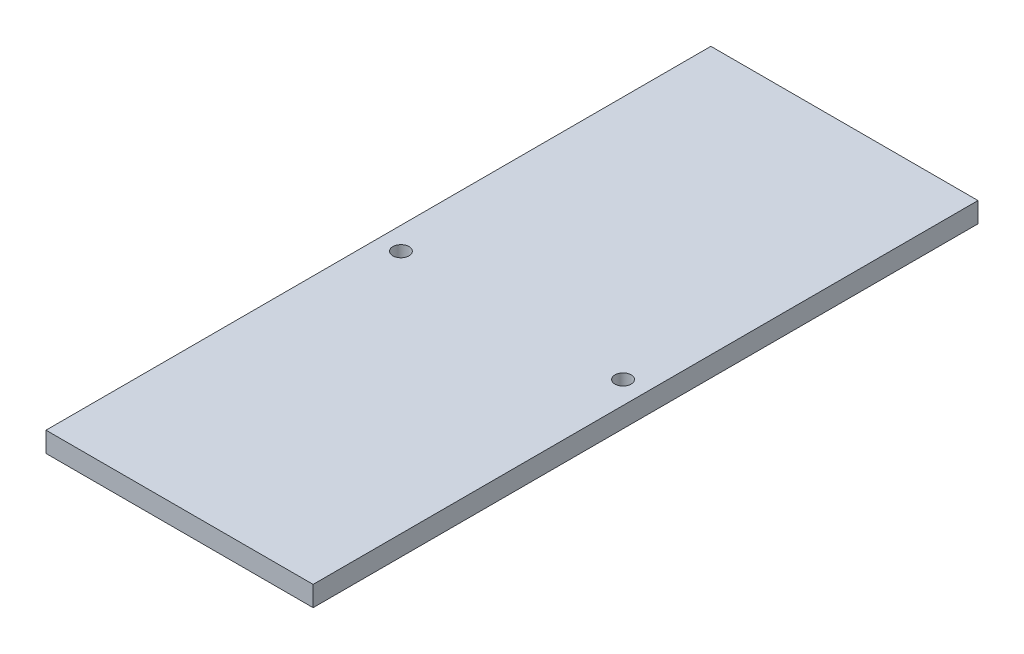
ISO-10303-21;
HEADER;
FILE_DESCRIPTION(('STEP AP214'),'2;1');
FILE_NAME('part.step','',(''),(''),'','','');
FILE_SCHEMA(('AUTOMOTIVE_DESIGN { 1 0 10303 214 1 1 1 1 }'));
ENDSEC;
DATA;
#1=APPLICATION_CONTEXT('core data for automotive mechanical design processes');
#2=APPLICATION_PROTOCOL_DEFINITION('international standard','automotive_design',2000,#1);
#3=PRODUCT_CONTEXT('',#1,'mechanical');
#4=PRODUCT('Part','Part','',(#3));
#5=PRODUCT_RELATED_PRODUCT_CATEGORY('part','',(#4));
#6=PRODUCT_DEFINITION_FORMATION('','',#4);
#7=PRODUCT_DEFINITION_CONTEXT('part definition',#1,'design');
#8=PRODUCT_DEFINITION('design','',#6,#7);
#9=PRODUCT_DEFINITION_SHAPE('','',#8);
#10=(LENGTH_UNIT() NAMED_UNIT(*) SI_UNIT(.MILLI.,.METRE.));
#11=(NAMED_UNIT(*) PLANE_ANGLE_UNIT() SI_UNIT($,.RADIAN.));
#12=(NAMED_UNIT(*) SI_UNIT($,.STERADIAN.) SOLID_ANGLE_UNIT());
#13=UNCERTAINTY_MEASURE_WITH_UNIT(LENGTH_MEASURE(1.E-05),#10,'distance_accuracy_value','');
#14=(GEOMETRIC_REPRESENTATION_CONTEXT(3) GLOBAL_UNCERTAINTY_ASSIGNED_CONTEXT((#13)) GLOBAL_UNIT_ASSIGNED_CONTEXT((#10,
#11,#12)) REPRESENTATION_CONTEXT('',''));
#15=CARTESIAN_POINT('',(0.,0.,0.));
#16=DIRECTION('',(0.,0.,1.));
#17=DIRECTION('',(1.,0.,0.));
#18=AXIS2_PLACEMENT_3D('',#15,#16,#17);
#19=CARTESIAN_POINT('',(0.,2.54,0.));
#20=DIRECTION('',(0.,-1.,0.));
#21=DIRECTION('',(0.,0.,-1.));
#22=AXIS2_PLACEMENT_3D('',#19,#20,#21);
#23=PLANE('',#22);
#24=DIRECTION('',(0.,0.,-1.));
#25=VECTOR('',#24,1.);
#26=CARTESIAN_POINT('',(16.7999973494214,2.54,41.8150899389298));
#27=LINE('',#26,#25);
#28=CARTESIAN_POINT('',(16.7999973494214,2.54,41.8150899389298));
#29=VERTEX_POINT('',#28);
#30=CARTESIAN_POINT('',(16.7999973494214,2.54,-41.8150899389298));
#31=VERTEX_POINT('',#30);
#32=EDGE_CURVE('E92',#29,#31,#27,.T.);
#33=ORIENTED_EDGE('',*,*,#32,.T.);
#34=DIRECTION('',(-1.,0.,0.));
#35=VECTOR('',#34,1.);
#36=CARTESIAN_POINT('',(-16.7999973494214,2.54,-41.8150899389298));
#37=LINE('',#36,#35);
#38=CARTESIAN_POINT('',(-16.7999973494214,2.54,-41.8150899389298));
#39=VERTEX_POINT('',#38);
#40=EDGE_CURVE('E87',#31,#39,#37,.T.);
#41=ORIENTED_EDGE('',*,*,#40,.T.);
#42=DIRECTION('',(0.,0.,1.));
#43=VECTOR('',#42,1.);
#44=CARTESIAN_POINT('',(-16.7999973494214,2.54,41.8150899389298));
#45=LINE('',#44,#43);
#46=CARTESIAN_POINT('',(-16.7999973494214,2.54,41.8150899389298));
#47=VERTEX_POINT('',#46);
#48=EDGE_CURVE('E90',#39,#47,#45,.T.);
#49=ORIENTED_EDGE('',*,*,#48,.T.);
#50=DIRECTION('',(1.,0.,0.));
#51=VECTOR('',#50,1.);
#52=CARTESIAN_POINT('',(-16.7999973494214,2.54,41.8150899389298));
#53=LINE('',#52,#51);
#54=EDGE_CURVE('E57',#47,#29,#53,.T.);
#55=ORIENTED_EDGE('',*,*,#54,.T.);
#56=EDGE_LOOP('',(#33,#41,#49,#55));
#57=FACE_BOUND('',#56,.T.);
#58=CARTESIAN_POINT('',(-13.97,2.54,0.));
#59=DIRECTION('',(0.,1.,0.));
#60=DIRECTION('',(0.,0.,1.));
#61=AXIS2_PLACEMENT_3D('',#58,#59,#60);
#62=CIRCLE('',#61,1.016);
#63=CARTESIAN_POINT('',(-13.97,2.54,1.016));
#64=VERTEX_POINT('',#63);
#65=EDGE_CURVE('E112',#64,#64,#62,.T.);
#66=ORIENTED_EDGE('',*,*,#65,.F.);
#67=EDGE_LOOP('',(#66));
#68=FACE_BOUND('',#67,.T.);
#69=CARTESIAN_POINT('',(13.97,2.54,0.));
#70=DIRECTION('',(0.,1.,0.));
#71=DIRECTION('',(0.,0.,1.));
#72=AXIS2_PLACEMENT_3D('',#69,#70,#71);
#73=CIRCLE('',#72,1.016);
#74=CARTESIAN_POINT('',(13.97,2.54,1.01599999999999));
#75=VERTEX_POINT('',#74);
#76=EDGE_CURVE('E134',#75,#75,#73,.T.);
#77=ORIENTED_EDGE('',*,*,#76,.F.);
#78=EDGE_LOOP('',(#77));
#79=FACE_BOUND('',#78,.T.);
#80=ADVANCED_FACE('F39',(#57,#68,#79),#23,.F.);
#81=CARTESIAN_POINT('',(0.,0.,0.));
#82=DIRECTION('',(0.,-1.,0.));
#83=DIRECTION('',(0.,0.,-1.));
#84=AXIS2_PLACEMENT_3D('',#81,#82,#83);
#85=PLANE('',#84);
#86=CARTESIAN_POINT('',(-13.97,0.,0.));
#87=DIRECTION('',(0.,1.,0.));
#88=DIRECTION('',(0.,0.,1.));
#89=AXIS2_PLACEMENT_3D('',#86,#87,#88);
#90=CIRCLE('',#89,1.016);
#91=CARTESIAN_POINT('',(-13.97,0.,1.016));
#92=VERTEX_POINT('',#91);
#93=EDGE_CURVE('E130',#92,#92,#90,.T.);
#94=ORIENTED_EDGE('',*,*,#93,.T.);
#95=EDGE_LOOP('',(#94));
#96=FACE_BOUND('',#95,.T.);
#97=DIRECTION('',(0.,0.,-1.));
#98=VECTOR('',#97,1.);
#99=CARTESIAN_POINT('',(16.7999973494214,0.,41.8150899389298));
#100=LINE('',#99,#98);
#101=CARTESIAN_POINT('',(16.7999973494214,0.,41.8150899389298));
#102=VERTEX_POINT('',#101);
#103=CARTESIAN_POINT('',(16.7999973494214,0.,-41.8150899389298));
#104=VERTEX_POINT('',#103);
#105=EDGE_CURVE('E108',#102,#104,#100,.T.);
#106=ORIENTED_EDGE('',*,*,#105,.F.);
#107=DIRECTION('',(1.,0.,0.));
#108=VECTOR('',#107,1.);
#109=CARTESIAN_POINT('',(-16.7999973494214,0.,41.8150899389298));
#110=LINE('',#109,#108);
#111=CARTESIAN_POINT('',(-16.7999973494214,0.,41.8150899389298));
#112=VERTEX_POINT('',#111);
#113=EDGE_CURVE('E80',#112,#102,#110,.T.);
#114=ORIENTED_EDGE('',*,*,#113,.F.);
#115=DIRECTION('',(0.,0.,1.));
#116=VECTOR('',#115,1.);
#117=CARTESIAN_POINT('',(-16.7999973494214,0.,41.8150899389298));
#118=LINE('',#117,#116);
#119=CARTESIAN_POINT('',(-16.7999973494214,0.,-41.8150899389298));
#120=VERTEX_POINT('',#119);
#121=EDGE_CURVE('E74',#120,#112,#118,.T.);
#122=ORIENTED_EDGE('',*,*,#121,.F.);
#123=DIRECTION('',(-1.,0.,0.));
#124=VECTOR('',#123,1.);
#125=CARTESIAN_POINT('',(-16.7999973494214,0.,-41.8150899389298));
#126=LINE('',#125,#124);
#127=EDGE_CURVE('E97',#104,#120,#126,.T.);
#128=ORIENTED_EDGE('',*,*,#127,.F.);
#129=EDGE_LOOP('',(#106,#114,#122,#128));
#130=FACE_BOUND('',#129,.T.);
#131=CARTESIAN_POINT('',(13.97,0.,0.));
#132=DIRECTION('',(0.,1.,0.));
#133=DIRECTION('',(0.,0.,1.));
#134=AXIS2_PLACEMENT_3D('',#131,#132,#133);
#135=CIRCLE('',#134,1.016);
#136=CARTESIAN_POINT('',(13.97,0.,1.01599999999999));
#137=VERTEX_POINT('',#136);
#138=EDGE_CURVE('E138',#137,#137,#135,.T.);
#139=ORIENTED_EDGE('',*,*,#138,.T.);
#140=EDGE_LOOP('',(#139));
#141=FACE_BOUND('',#140,.T.);
#142=ADVANCED_FACE('F125',(#96,#130,#141),#85,.T.);
#143=CARTESIAN_POINT('',(16.7999973494214,2.54,41.8150899389298));
#144=DIRECTION('',(-1.,0.,0.));
#145=DIRECTION('',(0.,0.,1.));
#146=AXIS2_PLACEMENT_3D('',#143,#144,#145);
#147=PLANE('',#146);
#148=ORIENTED_EDGE('',*,*,#105,.T.);
#149=DIRECTION('',(0.,-1.,0.));
#150=VECTOR('',#149,1.);
#151=CARTESIAN_POINT('',(16.7999973494214,2.54,-41.8150899389298));
#152=LINE('',#151,#150);
#153=EDGE_CURVE('E11',#31,#104,#152,.T.);
#154=ORIENTED_EDGE('',*,*,#153,.F.);
#155=ORIENTED_EDGE('',*,*,#32,.F.);
#156=DIRECTION('',(0.,-1.,0.));
#157=VECTOR('',#156,1.);
#158=CARTESIAN_POINT('',(16.7999973494214,2.54,41.8150899389298));
#159=LINE('',#158,#157);
#160=EDGE_CURVE('E104',#29,#102,#159,.T.);
#161=ORIENTED_EDGE('',*,*,#160,.T.);
#162=EDGE_LOOP('',(#148,#154,#155,#161));
#163=FACE_BOUND('',#162,.T.);
#164=ADVANCED_FACE('F41',(#163),#147,.F.);
#165=CARTESIAN_POINT('',(-16.7999973494214,2.54,-41.8150899389298));
#166=DIRECTION('',(0.,0.,1.));
#167=DIRECTION('',(1.,0.,0.));
#168=AXIS2_PLACEMENT_3D('',#165,#166,#167);
#169=PLANE('',#168);
#170=ORIENTED_EDGE('',*,*,#127,.T.);
#171=DIRECTION('',(0.,-1.,0.));
#172=VECTOR('',#171,1.);
#173=CARTESIAN_POINT('',(-16.7999973494214,2.54,-41.8150899389298));
#174=LINE('',#173,#172);
#175=EDGE_CURVE('E49',#39,#120,#174,.T.);
#176=ORIENTED_EDGE('',*,*,#175,.F.);
#177=ORIENTED_EDGE('',*,*,#40,.F.);
#178=ORIENTED_EDGE('',*,*,#153,.T.);
#179=EDGE_LOOP('',(#170,#176,#177,#178));
#180=FACE_BOUND('',#179,.T.);
#181=ADVANCED_FACE('F96',(#180),#169,.F.);
#182=CARTESIAN_POINT('',(-16.7999973494214,2.54,41.8150899389298));
#183=DIRECTION('',(1.,0.,0.));
#184=DIRECTION('',(0.,0.,-1.));
#185=AXIS2_PLACEMENT_3D('',#182,#183,#184);
#186=PLANE('',#185);
#187=ORIENTED_EDGE('',*,*,#121,.T.);
#188=DIRECTION('',(0.,-1.,0.));
#189=VECTOR('',#188,1.);
#190=CARTESIAN_POINT('',(-16.7999973494214,2.54,41.8150899389298));
#191=LINE('',#190,#189);
#192=EDGE_CURVE('E99',#47,#112,#191,.T.);
#193=ORIENTED_EDGE('',*,*,#192,.F.);
#194=ORIENTED_EDGE('',*,*,#48,.F.);
#195=ORIENTED_EDGE('',*,*,#175,.T.);
#196=EDGE_LOOP('',(#187,#193,#194,#195));
#197=FACE_BOUND('',#196,.T.);
#198=ADVANCED_FACE('F100',(#197),#186,.F.);
#199=CARTESIAN_POINT('',(-16.7999973494214,2.54,41.8150899389298));
#200=DIRECTION('',(0.,0.,-1.));
#201=DIRECTION('',(-1.,0.,0.));
#202=AXIS2_PLACEMENT_3D('',#199,#200,#201);
#203=PLANE('',#202);
#204=ORIENTED_EDGE('',*,*,#113,.T.);
#205=ORIENTED_EDGE('',*,*,#160,.F.);
#206=ORIENTED_EDGE('',*,*,#54,.F.);
#207=ORIENTED_EDGE('',*,*,#192,.T.);
#208=EDGE_LOOP('',(#204,#205,#206,#207));
#209=FACE_BOUND('',#208,.T.);
#210=ADVANCED_FACE('F122',(#209),#203,.F.);
#211=CARTESIAN_POINT('',(-13.97,2.54,0.));
#212=DIRECTION('',(0.,-1.,0.));
#213=DIRECTION('',(0.,0.,-1.));
#214=AXIS2_PLACEMENT_3D('',#211,#212,#213);
#215=CYLINDRICAL_SURFACE('',#214,1.016);
#216=ORIENTED_EDGE('',*,*,#65,.T.);
#217=EDGE_LOOP('',(#216));
#218=FACE_BOUND('',#217,.T.);
#219=ORIENTED_EDGE('',*,*,#93,.F.);
#220=EDGE_LOOP('',(#219));
#221=FACE_BOUND('',#220,.T.);
#222=ADVANCED_FACE('F157',(#218,#221),#215,.F.);
#223=CARTESIAN_POINT('',(13.97,2.54,0.));
#224=DIRECTION('',(0.,-1.,0.));
#225=DIRECTION('',(0.,0.,-1.));
#226=AXIS2_PLACEMENT_3D('',#223,#224,#225);
#227=CYLINDRICAL_SURFACE('',#226,1.016);
#228=ORIENTED_EDGE('',*,*,#76,.T.);
#229=EDGE_LOOP('',(#228));
#230=FACE_BOUND('',#229,.T.);
#231=ORIENTED_EDGE('',*,*,#138,.F.);
#232=EDGE_LOOP('',(#231));
#233=FACE_BOUND('',#232,.T.);
#234=ADVANCED_FACE('F146',(#230,#233),#227,.F.);
#235=CLOSED_SHELL('',(#80,#142,#164,#181,#198,#210,#222,#234));
#236=MANIFOLD_SOLID_BREP('B2',#235);
#237=ADVANCED_BREP_SHAPE_REPRESENTATION('',(#18,#236),#14);
#238=SHAPE_DEFINITION_REPRESENTATION(#9,#237);
ENDSEC;
END-ISO-10303-21;
